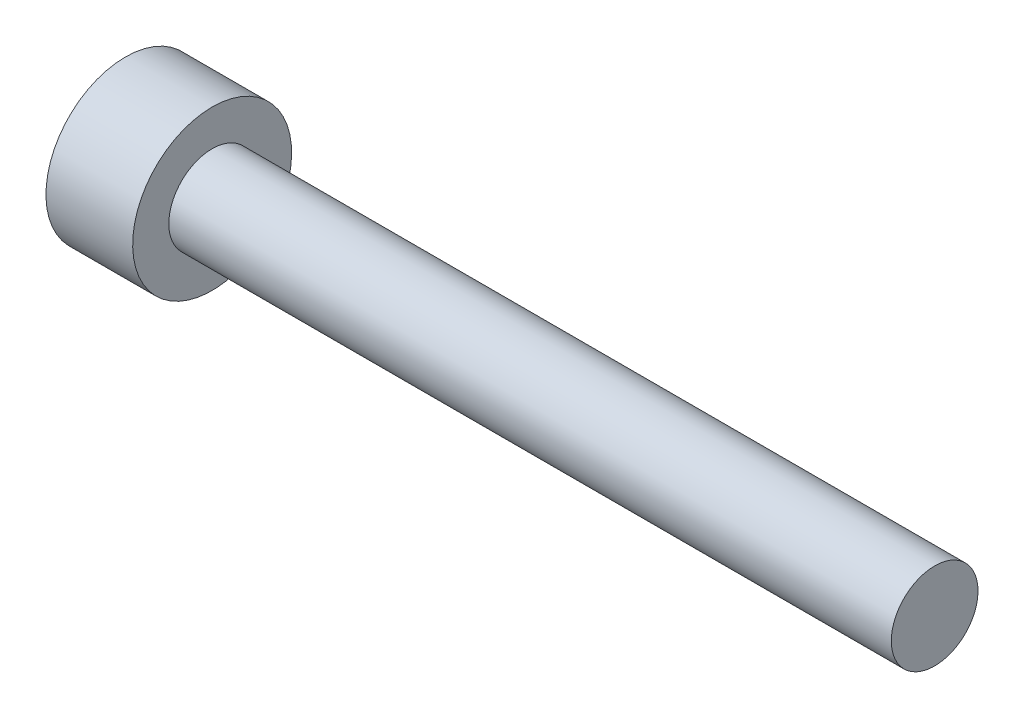
ISO-10303-21;
HEADER;
FILE_DESCRIPTION(('STEP AP214'),'2;1');
FILE_NAME('part.step','',(''),(''),'','','');
FILE_SCHEMA(('AUTOMOTIVE_DESIGN { 1 0 10303 214 1 1 1 1 }'));
ENDSEC;
DATA;
#1=APPLICATION_CONTEXT('core data for automotive mechanical design processes');
#2=APPLICATION_PROTOCOL_DEFINITION('international standard','automotive_design',2000,#1);
#3=PRODUCT_CONTEXT('',#1,'mechanical');
#4=PRODUCT('Part','Part','',(#3));
#5=PRODUCT_RELATED_PRODUCT_CATEGORY('part','',(#4));
#6=PRODUCT_DEFINITION_FORMATION('','',#4);
#7=PRODUCT_DEFINITION_CONTEXT('part definition',#1,'design');
#8=PRODUCT_DEFINITION('design','',#6,#7);
#9=PRODUCT_DEFINITION_SHAPE('','',#8);
#10=(LENGTH_UNIT() NAMED_UNIT(*) SI_UNIT(.MILLI.,.METRE.));
#11=(NAMED_UNIT(*) PLANE_ANGLE_UNIT() SI_UNIT($,.RADIAN.));
#12=(NAMED_UNIT(*) SI_UNIT($,.STERADIAN.) SOLID_ANGLE_UNIT());
#13=UNCERTAINTY_MEASURE_WITH_UNIT(LENGTH_MEASURE(1.E-05),#10,'distance_accuracy_value','');
#14=(GEOMETRIC_REPRESENTATION_CONTEXT(3) GLOBAL_UNCERTAINTY_ASSIGNED_CONTEXT((#13)) GLOBAL_UNIT_ASSIGNED_CONTEXT((#10,
#11,#12)) REPRESENTATION_CONTEXT('',''));
#15=CARTESIAN_POINT('',(0.,0.,0.));
#16=DIRECTION('',(0.,0.,1.));
#17=DIRECTION('',(1.,0.,0.));
#18=AXIS2_PLACEMENT_3D('',#15,#16,#17);
#19=CARTESIAN_POINT('',(0.,0.,0.));
#20=DIRECTION('',(-1.,0.,0.));
#21=DIRECTION('',(0.,-1.,0.));
#22=AXIS2_PLACEMENT_3D('',#19,#20,#21);
#23=PLANE('',#22);
#24=DIRECTION('',(0.,0.5,-0.866025403784438));
#25=VECTOR('',#24,1.);
#26=CARTESIAN_POINT('',(0.,0.736121593216774,1.275));
#27=LINE('',#26,#25);
#28=CARTESIAN_POINT('',(0.,0.736121593216774,1.275));
#29=VERTEX_POINT('',#28);
#30=CARTESIAN_POINT('',(0.,1.47224318643355,0.));
#31=VERTEX_POINT('',#30);
#32=EDGE_CURVE('E47',#29,#31,#27,.T.);
#33=ORIENTED_EDGE('',*,*,#32,.F.);
#34=DIRECTION('',(0.,1.,0.));
#35=VECTOR('',#34,1.);
#36=CARTESIAN_POINT('',(0.,-0.736121593216774,1.275));
#37=LINE('',#36,#35);
#38=CARTESIAN_POINT('',(0.,-0.736121593216774,1.275));
#39=VERTEX_POINT('',#38);
#40=EDGE_CURVE('E130',#39,#29,#37,.T.);
#41=ORIENTED_EDGE('',*,*,#40,.F.);
#42=DIRECTION('',(0.,0.5,0.866025403784439));
#43=VECTOR('',#42,1.);
#44=CARTESIAN_POINT('',(0.,-1.47224318643355,0.));
#45=LINE('',#44,#43);
#46=CARTESIAN_POINT('',(0.,-1.47224318643355,0.));
#47=VERTEX_POINT('',#46);
#48=EDGE_CURVE('E128',#47,#39,#45,.T.);
#49=ORIENTED_EDGE('',*,*,#48,.F.);
#50=DIRECTION('',(0.,-0.5,0.866025403784439));
#51=VECTOR('',#50,1.);
#52=CARTESIAN_POINT('',(0.,-0.736121593216773,-1.275));
#53=LINE('',#52,#51);
#54=CARTESIAN_POINT('',(0.,-0.736121593216773,-1.275));
#55=VERTEX_POINT('',#54);
#56=EDGE_CURVE('E95',#55,#47,#53,.T.);
#57=ORIENTED_EDGE('',*,*,#56,.F.);
#58=DIRECTION('',(0.,-1.,0.));
#59=VECTOR('',#58,1.);
#60=CARTESIAN_POINT('',(0.,0.736121593216773,-1.275));
#61=LINE('',#60,#59);
#62=CARTESIAN_POINT('',(0.,0.736121593216773,-1.275));
#63=VERTEX_POINT('',#62);
#64=EDGE_CURVE('E124',#63,#55,#61,.T.);
#65=ORIENTED_EDGE('',*,*,#64,.F.);
#66=DIRECTION('',(0.,-0.5,-0.866025403784439));
#67=VECTOR('',#66,1.);
#68=CARTESIAN_POINT('',(0.,1.47224318643355,0.));
#69=LINE('',#68,#67);
#70=EDGE_CURVE('E121',#31,#63,#69,.T.);
#71=ORIENTED_EDGE('',*,*,#70,.F.);
#72=EDGE_LOOP('',(#33,#41,#49,#57,#65,#71));
#73=FACE_BOUND('',#72,.T.);
#74=CARTESIAN_POINT('',(0.,0.,0.));
#75=DIRECTION('',(1.,0.,0.));
#76=DIRECTION('',(0.,1.,0.));
#77=AXIS2_PLACEMENT_3D('',#74,#75,#76);
#78=CIRCLE('',#77,2.75);
#79=CARTESIAN_POINT('',(0.,2.75,0.));
#80=VERTEX_POINT('',#79);
#81=EDGE_CURVE('E11',#80,#80,#78,.T.);
#82=ORIENTED_EDGE('',*,*,#81,.F.);
#83=EDGE_LOOP('',(#82));
#84=FACE_BOUND('',#83,.T.);
#85=ADVANCED_FACE('F33',(#73,#84),#23,.T.);
#86=CARTESIAN_POINT('',(28.,0.,0.));
#87=DIRECTION('',(1.,0.,0.));
#88=DIRECTION('',(0.,1.,0.));
#89=AXIS2_PLACEMENT_3D('',#86,#87,#88);
#90=CYLINDRICAL_SURFACE('',#89,2.75);
#91=ORIENTED_EDGE('',*,*,#81,.T.);
#92=EDGE_LOOP('',(#91));
#93=FACE_BOUND('',#92,.T.);
#94=CARTESIAN_POINT('',(3.,0.,0.));
#95=DIRECTION('',(1.,0.,0.));
#96=DIRECTION('',(0.,1.,0.));
#97=AXIS2_PLACEMENT_3D('',#94,#95,#96);
#98=CIRCLE('',#97,2.75);
#99=CARTESIAN_POINT('',(3.,2.75,0.));
#100=VERTEX_POINT('',#99);
#101=EDGE_CURVE('E40',#100,#100,#98,.T.);
#102=ORIENTED_EDGE('',*,*,#101,.F.);
#103=EDGE_LOOP('',(#102));
#104=FACE_BOUND('',#103,.T.);
#105=ADVANCED_FACE('F150',(#93,#104),#90,.T.);
#106=CARTESIAN_POINT('',(3.,2.75,0.));
#107=DIRECTION('',(1.,0.,0.));
#108=DIRECTION('',(0.,1.,0.));
#109=AXIS2_PLACEMENT_3D('',#106,#107,#108);
#110=PLANE('',#109);
#111=ORIENTED_EDGE('',*,*,#101,.T.);
#112=EDGE_LOOP('',(#111));
#113=FACE_BOUND('',#112,.T.);
#114=CARTESIAN_POINT('',(3.,0.,0.));
#115=DIRECTION('',(1.,0.,0.));
#116=DIRECTION('',(0.,1.,0.));
#117=AXIS2_PLACEMENT_3D('',#114,#115,#116);
#118=CIRCLE('',#117,1.5);
#119=CARTESIAN_POINT('',(3.,1.5,0.));
#120=VERTEX_POINT('',#119);
#121=EDGE_CURVE('E142',#120,#120,#118,.T.);
#122=ORIENTED_EDGE('',*,*,#121,.F.);
#123=EDGE_LOOP('',(#122));
#124=FACE_BOUND('',#123,.T.);
#125=ADVANCED_FACE('F147',(#113,#124),#110,.T.);
#126=CARTESIAN_POINT('',(28.,0.,0.));
#127=DIRECTION('',(1.,0.,0.));
#128=DIRECTION('',(0.,1.,0.));
#129=AXIS2_PLACEMENT_3D('',#126,#127,#128);
#130=CYLINDRICAL_SURFACE('',#129,1.5);
#131=ORIENTED_EDGE('',*,*,#121,.T.);
#132=EDGE_LOOP('',(#131));
#133=FACE_BOUND('',#132,.T.);
#134=CARTESIAN_POINT('',(28.,0.,0.));
#135=DIRECTION('',(1.,0.,0.));
#136=DIRECTION('',(0.,1.,0.));
#137=AXIS2_PLACEMENT_3D('',#134,#135,#136);
#138=CIRCLE('',#137,1.5);
#139=CARTESIAN_POINT('',(28.,1.5,0.));
#140=VERTEX_POINT('',#139);
#141=EDGE_CURVE('E134',#140,#140,#138,.T.);
#142=ORIENTED_EDGE('',*,*,#141,.F.);
#143=EDGE_LOOP('',(#142));
#144=FACE_BOUND('',#143,.T.);
#145=ADVANCED_FACE('F157',(#133,#144),#130,.T.);
#146=CARTESIAN_POINT('',(28.,1.5,0.));
#147=DIRECTION('',(1.,0.,0.));
#148=DIRECTION('',(0.,1.,0.));
#149=AXIS2_PLACEMENT_3D('',#146,#147,#148);
#150=PLANE('',#149);
#151=ORIENTED_EDGE('',*,*,#141,.T.);
#152=EDGE_LOOP('',(#151));
#153=FACE_BOUND('',#152,.T.);
#154=ADVANCED_FACE('F163',(#153),#150,.T.);
#155=CARTESIAN_POINT('',(1.3,0.736121593216774,1.275));
#156=DIRECTION('',(0.,0.866025403784439,0.5));
#157=DIRECTION('',(0.,-0.5,0.866025403784439));
#158=AXIS2_PLACEMENT_3D('',#155,#156,#157);
#159=PLANE('',#158);
#160=ORIENTED_EDGE('',*,*,#32,.T.);
#161=DIRECTION('',(-1.,0.,0.));
#162=VECTOR('',#161,1.);
#163=CARTESIAN_POINT('',(1.3,1.47224318643355,0.));
#164=LINE('',#163,#162);
#165=CARTESIAN_POINT('',(1.3,1.47224318643355,0.));
#166=VERTEX_POINT('',#165);
#167=EDGE_CURVE('E77',#166,#31,#164,.T.);
#168=ORIENTED_EDGE('',*,*,#167,.F.);
#169=DIRECTION('',(0.,0.5,-0.866025403784438));
#170=VECTOR('',#169,1.);
#171=CARTESIAN_POINT('',(1.3,0.736121593216774,1.275));
#172=LINE('',#171,#170);
#173=CARTESIAN_POINT('',(1.3,0.736121593216774,1.275));
#174=VERTEX_POINT('',#173);
#175=EDGE_CURVE('E132',#174,#166,#172,.T.);
#176=ORIENTED_EDGE('',*,*,#175,.F.);
#177=DIRECTION('',(-1.,0.,0.));
#178=VECTOR('',#177,1.);
#179=CARTESIAN_POINT('',(1.3,0.736121593216774,1.275));
#180=LINE('',#179,#178);
#181=EDGE_CURVE('E55',#174,#29,#180,.T.);
#182=ORIENTED_EDGE('',*,*,#181,.T.);
#183=EDGE_LOOP('',(#160,#168,#176,#182));
#184=FACE_BOUND('',#183,.T.);
#185=ADVANCED_FACE('F167',(#184),#159,.F.);
#186=CARTESIAN_POINT('',(1.3,-0.736121593216774,1.275));
#187=DIRECTION('',(0.,0.,1.));
#188=DIRECTION('',(1.,0.,0.));
#189=AXIS2_PLACEMENT_3D('',#186,#187,#188);
#190=PLANE('',#189);
#191=ORIENTED_EDGE('',*,*,#40,.T.);
#192=ORIENTED_EDGE('',*,*,#181,.F.);
#193=DIRECTION('',(0.,1.,0.));
#194=VECTOR('',#193,1.);
#195=CARTESIAN_POINT('',(1.3,-0.736121593216774,1.275));
#196=LINE('',#195,#194);
#197=CARTESIAN_POINT('',(1.3,-0.736121593216774,1.275));
#198=VERTEX_POINT('',#197);
#199=EDGE_CURVE('E107',#198,#174,#196,.T.);
#200=ORIENTED_EDGE('',*,*,#199,.F.);
#201=DIRECTION('',(-1.,0.,0.));
#202=VECTOR('',#201,1.);
#203=CARTESIAN_POINT('',(1.3,-0.736121593216774,1.275));
#204=LINE('',#203,#202);
#205=EDGE_CURVE('E99',#198,#39,#204,.T.);
#206=ORIENTED_EDGE('',*,*,#205,.T.);
#207=EDGE_LOOP('',(#191,#192,#200,#206));
#208=FACE_BOUND('',#207,.T.);
#209=ADVANCED_FACE('F171',(#208),#190,.F.);
#210=CARTESIAN_POINT('',(1.3,-1.47224318643355,0.));
#211=DIRECTION('',(0.,-0.866025403784439,0.5));
#212=DIRECTION('',(0.,-0.5,-0.866025403784439));
#213=AXIS2_PLACEMENT_3D('',#210,#211,#212);
#214=PLANE('',#213);
#215=ORIENTED_EDGE('',*,*,#48,.T.);
#216=ORIENTED_EDGE('',*,*,#205,.F.);
#217=DIRECTION('',(0.,0.5,0.866025403784439));
#218=VECTOR('',#217,1.);
#219=CARTESIAN_POINT('',(1.3,-1.47224318643355,0.));
#220=LINE('',#219,#218);
#221=CARTESIAN_POINT('',(1.3,-1.47224318643355,0.));
#222=VERTEX_POINT('',#221);
#223=EDGE_CURVE('E103',#222,#198,#220,.T.);
#224=ORIENTED_EDGE('',*,*,#223,.F.);
#225=DIRECTION('',(-1.,0.,0.));
#226=VECTOR('',#225,1.);
#227=CARTESIAN_POINT('',(1.3,-1.47224318643355,0.));
#228=LINE('',#227,#226);
#229=EDGE_CURVE('E88',#222,#47,#228,.T.);
#230=ORIENTED_EDGE('',*,*,#229,.T.);
#231=EDGE_LOOP('',(#215,#216,#224,#230));
#232=FACE_BOUND('',#231,.T.);
#233=ADVANCED_FACE('F104',(#232),#214,.F.);
#234=CARTESIAN_POINT('',(1.3,-0.736121593216773,-1.275));
#235=DIRECTION('',(0.,-0.866025403784439,-0.5));
#236=DIRECTION('',(0.,0.5,-0.866025403784439));
#237=AXIS2_PLACEMENT_3D('',#234,#235,#236);
#238=PLANE('',#237);
#239=ORIENTED_EDGE('',*,*,#56,.T.);
#240=ORIENTED_EDGE('',*,*,#229,.F.);
#241=DIRECTION('',(0.,-0.5,0.866025403784439));
#242=VECTOR('',#241,1.);
#243=CARTESIAN_POINT('',(1.3,-0.736121593216773,-1.275));
#244=LINE('',#243,#242);
#245=CARTESIAN_POINT('',(1.3,-0.736121593216773,-1.275));
#246=VERTEX_POINT('',#245);
#247=EDGE_CURVE('E92',#246,#222,#244,.T.);
#248=ORIENTED_EDGE('',*,*,#247,.F.);
#249=DIRECTION('',(-1.,0.,0.));
#250=VECTOR('',#249,1.);
#251=CARTESIAN_POINT('',(1.3,-0.736121593216773,-1.275));
#252=LINE('',#251,#250);
#253=EDGE_CURVE('E100',#246,#55,#252,.T.);
#254=ORIENTED_EDGE('',*,*,#253,.T.);
#255=EDGE_LOOP('',(#239,#240,#248,#254));
#256=FACE_BOUND('',#255,.T.);
#257=ADVANCED_FACE('F90',(#256),#238,.F.);
#258=CARTESIAN_POINT('',(1.3,0.736121593216773,-1.275));
#259=DIRECTION('',(0.,0.,-1.));
#260=DIRECTION('',(-1.,0.,0.));
#261=AXIS2_PLACEMENT_3D('',#258,#259,#260);
#262=PLANE('',#261);
#263=ORIENTED_EDGE('',*,*,#64,.T.);
#264=ORIENTED_EDGE('',*,*,#253,.F.);
#265=DIRECTION('',(0.,-1.,0.));
#266=VECTOR('',#265,1.);
#267=CARTESIAN_POINT('',(1.3,0.736121593216773,-1.275));
#268=LINE('',#267,#266);
#269=CARTESIAN_POINT('',(1.3,0.736121593216773,-1.275));
#270=VERTEX_POINT('',#269);
#271=EDGE_CURVE('E113',#270,#246,#268,.T.);
#272=ORIENTED_EDGE('',*,*,#271,.F.);
#273=DIRECTION('',(-1.,0.,0.));
#274=VECTOR('',#273,1.);
#275=CARTESIAN_POINT('',(1.3,0.736121593216773,-1.275));
#276=LINE('',#275,#274);
#277=EDGE_CURVE('E137',#270,#63,#276,.T.);
#278=ORIENTED_EDGE('',*,*,#277,.T.);
#279=EDGE_LOOP('',(#263,#264,#272,#278));
#280=FACE_BOUND('',#279,.T.);
#281=ADVANCED_FACE('F175',(#280),#262,.F.);
#282=CARTESIAN_POINT('',(1.3,1.47224318643355,0.));
#283=DIRECTION('',(0.,0.866025403784439,-0.5));
#284=DIRECTION('',(0.,0.5,0.866025403784439));
#285=AXIS2_PLACEMENT_3D('',#282,#283,#284);
#286=PLANE('',#285);
#287=ORIENTED_EDGE('',*,*,#70,.T.);
#288=ORIENTED_EDGE('',*,*,#277,.F.);
#289=DIRECTION('',(0.,-0.5,-0.866025403784439));
#290=VECTOR('',#289,1.);
#291=CARTESIAN_POINT('',(1.3,1.47224318643355,0.));
#292=LINE('',#291,#290);
#293=EDGE_CURVE('E115',#166,#270,#292,.T.);
#294=ORIENTED_EDGE('',*,*,#293,.F.);
#295=ORIENTED_EDGE('',*,*,#167,.T.);
#296=EDGE_LOOP('',(#287,#288,#294,#295));
#297=FACE_BOUND('',#296,.T.);
#298=ADVANCED_FACE('F172',(#297),#286,.F.);
#299=CARTESIAN_POINT('',(1.3,0.,0.));
#300=DIRECTION('',(-1.,0.,0.));
#301=DIRECTION('',(0.,-1.,0.));
#302=AXIS2_PLACEMENT_3D('',#299,#300,#301);
#303=PLANE('',#302);
#304=ORIENTED_EDGE('',*,*,#175,.T.);
#305=ORIENTED_EDGE('',*,*,#293,.T.);
#306=ORIENTED_EDGE('',*,*,#271,.T.);
#307=ORIENTED_EDGE('',*,*,#247,.T.);
#308=ORIENTED_EDGE('',*,*,#223,.T.);
#309=ORIENTED_EDGE('',*,*,#199,.T.);
#310=EDGE_LOOP('',(#304,#305,#306,#307,#308,#309));
#311=FACE_BOUND('',#310,.T.);
#312=ADVANCED_FACE('F110',(#311),#303,.T.);
#313=CLOSED_SHELL('',(#85,#105,#125,#145,#154,#185,#209,#233,#257,#281,#298,#312));
#314=MANIFOLD_SOLID_BREP('B2',#313);
#315=ADVANCED_BREP_SHAPE_REPRESENTATION('',(#18,#314),#14);
#316=SHAPE_DEFINITION_REPRESENTATION(#9,#315);
ENDSEC;
END-ISO-10303-21;
